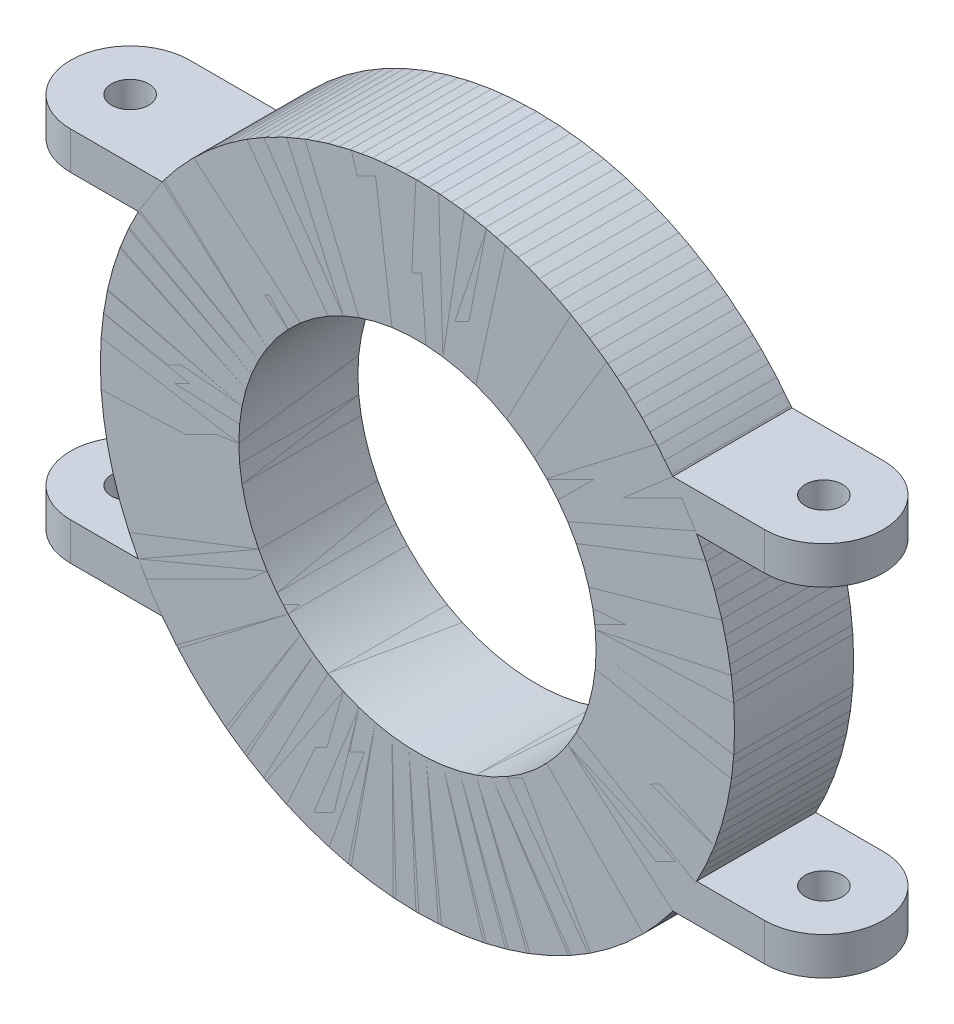
ISO-10303-21;
HEADER;
FILE_DESCRIPTION(('STEP AP214'),'2;1');
FILE_NAME('part.step','',(''),(''),'','','');
FILE_SCHEMA(('AUTOMOTIVE_DESIGN { 1 0 10303 214 1 1 1 1 }'));
ENDSEC;
DATA;
#1=APPLICATION_CONTEXT('core data for automotive mechanical design processes');
#2=APPLICATION_PROTOCOL_DEFINITION('international standard','automotive_design',2000,#1);
#3=PRODUCT_CONTEXT('',#1,'mechanical');
#4=PRODUCT('Part','Part','',(#3));
#5=PRODUCT_RELATED_PRODUCT_CATEGORY('part','',(#4));
#6=PRODUCT_DEFINITION_FORMATION('','',#4);
#7=PRODUCT_DEFINITION_CONTEXT('part definition',#1,'design');
#8=PRODUCT_DEFINITION('design','',#6,#7);
#9=PRODUCT_DEFINITION_SHAPE('','',#8);
#10=(LENGTH_UNIT() NAMED_UNIT(*) SI_UNIT(.MILLI.,.METRE.));
#11=(NAMED_UNIT(*) PLANE_ANGLE_UNIT() SI_UNIT($,.RADIAN.));
#12=(NAMED_UNIT(*) SI_UNIT($,.STERADIAN.) SOLID_ANGLE_UNIT());
#13=UNCERTAINTY_MEASURE_WITH_UNIT(LENGTH_MEASURE(1.E-05),#10,'distance_accuracy_value','');
#14=(GEOMETRIC_REPRESENTATION_CONTEXT(3) GLOBAL_UNCERTAINTY_ASSIGNED_CONTEXT((#13)) GLOBAL_UNIT_ASSIGNED_CONTEXT((#10,
#11,#12)) REPRESENTATION_CONTEXT('',''));
#15=CARTESIAN_POINT('',(0.,0.,0.));
#16=DIRECTION('',(0.,0.,1.));
#17=DIRECTION('',(1.,0.,0.));
#18=AXIS2_PLACEMENT_3D('',#15,#16,#17);
#19=CARTESIAN_POINT('',(0.,0.,8.));
#20=DIRECTION('',(0.,0.,-1.));
#21=DIRECTION('',(1.,0.,0.));
#22=AXIS2_PLACEMENT_3D('',#19,#20,#21);
#23=CYLINDRICAL_SURFACE('',#22,21.3);
#24=DIRECTION('',(0.,0.,-1.));
#25=VECTOR('',#24,1.);
#26=CARTESIAN_POINT('',(-17.1475286190912,12.6353576228553,8.));
#27=LINE('',#26,#25);
#28=CARTESIAN_POINT('',(-17.1475286190912,12.6353576228553,8.));
#29=VERTEX_POINT('',#28);
#30=CARTESIAN_POINT('',(-17.1475286190912,12.6353576228553,0.));
#31=VERTEX_POINT('',#30);
#32=EDGE_CURVE('E98',#29,#31,#27,.T.);
#33=ORIENTED_EDGE('',*,*,#32,.F.);
#34=CARTESIAN_POINT('',(0.,0.,8.));
#35=DIRECTION('',(0.,0.,1.));
#36=DIRECTION('',(-1.,0.,0.));
#37=AXIS2_PLACEMENT_3D('',#34,#35,#36);
#38=CIRCLE('',#37,21.3);
#39=CARTESIAN_POINT('',(-17.1475286190912,-12.6353576228553,8.));
#40=VERTEX_POINT('',#39);
#41=EDGE_CURVE('E82',#40,#29,#38,.T.);
#42=ORIENTED_EDGE('',*,*,#41,.F.);
#43=DIRECTION('',(0.,0.,-1.));
#44=VECTOR('',#43,1.);
#45=CARTESIAN_POINT('',(-17.1475286190912,-12.6353576228553,8.));
#46=LINE('',#45,#44);
#47=CARTESIAN_POINT('',(-17.1475286190912,-12.6353576228553,0.));
#48=VERTEX_POINT('',#47);
#49=EDGE_CURVE('E205',#40,#48,#46,.T.);
#50=ORIENTED_EDGE('',*,*,#49,.T.);
#51=CARTESIAN_POINT('',(0.,0.,0.));
#52=DIRECTION('',(0.,0.,1.));
#53=DIRECTION('',(-1.,0.,0.));
#54=AXIS2_PLACEMENT_3D('',#51,#52,#53);
#55=CIRCLE('',#54,21.3);
#56=EDGE_CURVE('E208',#48,#31,#55,.T.);
#57=ORIENTED_EDGE('',*,*,#56,.T.);
#58=EDGE_LOOP('',(#33,#42,#50,#57));
#59=FACE_BOUND('',#58,.T.);
#60=ADVANCED_FACE('F73',(#59),#23,.T.);
#61=CARTESIAN_POINT('',(-18.7510287943154,10.1039061335086,8.));
#62=VERTEX_POINT('',#61);
#63=CARTESIAN_POINT('',(-18.7510287943154,-10.1039061335086,8.));
#64=VERTEX_POINT('',#63);
#65=EDGE_CURVE('E90',#62,#64,#38,.T.);
#66=ORIENTED_EDGE('',*,*,#65,.F.);
#67=DIRECTION('',(0.,0.,-1.));
#68=VECTOR('',#67,1.);
#69=CARTESIAN_POINT('',(-18.7510287943154,10.1039061335086,8.));
#70=LINE('',#69,#68);
#71=CARTESIAN_POINT('',(-18.7510287943154,10.1039061335086,0.));
#72=VERTEX_POINT('',#71);
#73=EDGE_CURVE('E183',#62,#72,#70,.T.);
#74=ORIENTED_EDGE('',*,*,#73,.T.);
#75=CARTESIAN_POINT('',(-18.7510287943154,-10.1039061335086,0.));
#76=VERTEX_POINT('',#75);
#77=EDGE_CURVE('E207',#72,#76,#55,.T.);
#78=ORIENTED_EDGE('',*,*,#77,.T.);
#79=DIRECTION('',(0.,0.,-1.));
#80=VECTOR('',#79,1.);
#81=CARTESIAN_POINT('',(-18.7510287943154,-10.1039061335086,8.));
#82=LINE('',#81,#80);
#83=EDGE_CURVE('E202',#64,#76,#82,.T.);
#84=ORIENTED_EDGE('',*,*,#83,.F.);
#85=EDGE_LOOP('',(#66,#74,#78,#84));
#86=FACE_BOUND('',#85,.T.);
#87=ADVANCED_FACE('F75',(#86),#23,.T.);
#88=CARTESIAN_POINT('',(0.,0.,8.));
#89=DIRECTION('',(0.,0.,-1.));
#90=DIRECTION('',(1.,0.,0.));
#91=AXIS2_PLACEMENT_3D('',#88,#89,#90);
#92=CYLINDRICAL_SURFACE('',#91,12.);
#93=CARTESIAN_POINT('',(0.,0.,8.));
#94=DIRECTION('',(0.,0.,1.));
#95=DIRECTION('',(-1.,0.,0.));
#96=AXIS2_PLACEMENT_3D('',#93,#94,#95);
#97=CIRCLE('',#96,12.);
#98=CARTESIAN_POINT('',(-12.,0.,8.));
#99=VERTEX_POINT('',#98);
#100=EDGE_CURVE('E13',#99,#99,#97,.T.);
#101=ORIENTED_EDGE('',*,*,#100,.T.);
#102=EDGE_LOOP('',(#101));
#103=FACE_BOUND('',#102,.T.);
#104=CARTESIAN_POINT('',(0.,0.,0.));
#105=DIRECTION('',(0.,0.,1.));
#106=DIRECTION('',(-1.,0.,0.));
#107=AXIS2_PLACEMENT_3D('',#104,#105,#106);
#108=CIRCLE('',#107,12.);
#109=CARTESIAN_POINT('',(-12.,0.,0.));
#110=VERTEX_POINT('',#109);
#111=EDGE_CURVE('E77',#110,#110,#108,.T.);
#112=ORIENTED_EDGE('',*,*,#111,.F.);
#113=EDGE_LOOP('',(#112));
#114=FACE_BOUND('',#113,.T.);
#115=ADVANCED_FACE('F243',(#103,#114),#92,.F.);
#116=CARTESIAN_POINT('',(0.,0.,8.));
#117=DIRECTION('',(0.,0.,1.));
#118=DIRECTION('',(-1.,0.,0.));
#119=AXIS2_PLACEMENT_3D('',#116,#117,#118);
#120=PLANE('',#119);
#121=ORIENTED_EDGE('',*,*,#41,.T.);
#122=DIRECTION('',(1.,0.,0.));
#123=VECTOR('',#122,1.);
#124=CARTESIAN_POINT('',(-23.3,12.6353576228553,8.));
#125=LINE('',#124,#123);
#126=CARTESIAN_POINT('',(-23.3,12.6353576228553,8.));
#127=VERTEX_POINT('',#126);
#128=EDGE_CURVE('E179',#127,#29,#125,.T.);
#129=ORIENTED_EDGE('',*,*,#128,.F.);
#130=DIRECTION('',(0.,-1.,0.));
#131=VECTOR('',#130,1.);
#132=CARTESIAN_POINT('',(-23.3,0.,8.));
#133=LINE('',#132,#131);
#134=CARTESIAN_POINT('',(-23.3,10.1039061335086,8.));
#135=VERTEX_POINT('',#134);
#136=EDGE_CURVE('E150',#127,#135,#133,.T.);
#137=ORIENTED_EDGE('',*,*,#136,.T.);
#138=DIRECTION('',(1.,0.,0.));
#139=VECTOR('',#138,1.);
#140=CARTESIAN_POINT('',(-23.3,10.1039061335086,8.));
#141=LINE('',#140,#139);
#142=EDGE_CURVE('E174',#135,#62,#141,.T.);
#143=ORIENTED_EDGE('',*,*,#142,.T.);
#144=ORIENTED_EDGE('',*,*,#65,.T.);
#145=DIRECTION('',(1.,0.,0.));
#146=VECTOR('',#145,1.);
#147=CARTESIAN_POINT('',(-23.3,-10.1039061335086,8.));
#148=LINE('',#147,#146);
#149=CARTESIAN_POINT('',(-23.3,-10.1039061335086,8.));
#150=VERTEX_POINT('',#149);
#151=EDGE_CURVE('E193',#150,#64,#148,.T.);
#152=ORIENTED_EDGE('',*,*,#151,.F.);
#153=DIRECTION('',(0.,1.,0.));
#154=VECTOR('',#153,1.);
#155=CARTESIAN_POINT('',(-23.3,0.,8.));
#156=LINE('',#155,#154);
#157=CARTESIAN_POINT('',(-23.3,-12.6353576228553,8.));
#158=VERTEX_POINT('',#157);
#159=EDGE_CURVE('E188',#158,#150,#156,.T.);
#160=ORIENTED_EDGE('',*,*,#159,.F.);
#161=DIRECTION('',(1.,0.,0.));
#162=VECTOR('',#161,1.);
#163=CARTESIAN_POINT('',(-23.3,-12.6353576228553,8.));
#164=LINE('',#163,#162);
#165=EDGE_CURVE('E196',#158,#40,#164,.T.);
#166=ORIENTED_EDGE('',*,*,#165,.T.);
#167=EDGE_LOOP('',(#121,#129,#137,#143,#144,#152,#160,#166));
#168=FACE_BOUND('',#167,.T.);
#169=ORIENTED_EDGE('',*,*,#100,.F.);
#170=EDGE_LOOP('',(#169));
#171=FACE_BOUND('',#170,.T.);
#172=ADVANCED_FACE('F221',(#168,#171),#120,.T.);
#173=CARTESIAN_POINT('',(0.,0.,0.));
#174=DIRECTION('',(0.,0.,1.));
#175=DIRECTION('',(-1.,0.,0.));
#176=AXIS2_PLACEMENT_3D('',#173,#174,#175);
#177=PLANE('',#176);
#178=ORIENTED_EDGE('',*,*,#77,.F.);
#179=DIRECTION('',(1.,0.,0.));
#180=VECTOR('',#179,1.);
#181=CARTESIAN_POINT('',(-23.3,10.1039061335086,0.));
#182=LINE('',#181,#180);
#183=CARTESIAN_POINT('',(-23.3,10.1039061335086,0.));
#184=VERTEX_POINT('',#183);
#185=EDGE_CURVE('E149',#184,#72,#182,.T.);
#186=ORIENTED_EDGE('',*,*,#185,.F.);
#187=DIRECTION('',(0.,-1.,0.));
#188=VECTOR('',#187,1.);
#189=CARTESIAN_POINT('',(-23.3,12.6353576228553,0.));
#190=LINE('',#189,#188);
#191=CARTESIAN_POINT('',(-23.3,12.6353576228553,0.));
#192=VERTEX_POINT('',#191);
#193=EDGE_CURVE('E153',#192,#184,#190,.T.);
#194=ORIENTED_EDGE('',*,*,#193,.F.);
#195=DIRECTION('',(1.,0.,0.));
#196=VECTOR('',#195,1.);
#197=CARTESIAN_POINT('',(-23.3,12.6353576228553,0.));
#198=LINE('',#197,#196);
#199=EDGE_CURVE('E141',#192,#31,#198,.T.);
#200=ORIENTED_EDGE('',*,*,#199,.T.);
#201=ORIENTED_EDGE('',*,*,#56,.F.);
#202=DIRECTION('',(1.,0.,0.));
#203=VECTOR('',#202,1.);
#204=CARTESIAN_POINT('',(-23.3,-12.6353576228553,0.));
#205=LINE('',#204,#203);
#206=CARTESIAN_POINT('',(-23.3,-12.6353576228553,0.));
#207=VERTEX_POINT('',#206);
#208=EDGE_CURVE('E199',#207,#48,#205,.T.);
#209=ORIENTED_EDGE('',*,*,#208,.F.);
#210=DIRECTION('',(0.,1.,0.));
#211=VECTOR('',#210,1.);
#212=CARTESIAN_POINT('',(-23.3,0.,0.));
#213=LINE('',#212,#211);
#214=CARTESIAN_POINT('',(-23.3,-10.1039061335086,0.));
#215=VERTEX_POINT('',#214);
#216=EDGE_CURVE('E185',#207,#215,#213,.T.);
#217=ORIENTED_EDGE('',*,*,#216,.T.);
#218=DIRECTION('',(1.,0.,0.));
#219=VECTOR('',#218,1.);
#220=CARTESIAN_POINT('',(-23.3,-10.1039061335086,0.));
#221=LINE('',#220,#219);
#222=EDGE_CURVE('E190',#215,#76,#221,.T.);
#223=ORIENTED_EDGE('',*,*,#222,.T.);
#224=EDGE_LOOP('',(#178,#186,#194,#200,#201,#209,#217,#223));
#225=FACE_BOUND('',#224,.T.);
#226=ORIENTED_EDGE('',*,*,#111,.T.);
#227=EDGE_LOOP('',(#226));
#228=FACE_BOUND('',#227,.T.);
#229=ADVANCED_FACE('F154',(#225,#228),#177,.F.);
#230=CARTESIAN_POINT('',(-23.3,-12.6353576228553,0.));
#231=DIRECTION('',(0.,-1.,0.));
#232=DIRECTION('',(0.,0.,1.));
#233=AXIS2_PLACEMENT_3D('',#230,#231,#232);
#234=PLANE('',#233);
#235=CARTESIAN_POINT('',(-23.3,-12.6353576228553,4.));
#236=DIRECTION('',(0.,-1.,0.));
#237=DIRECTION('',(0.,0.,1.));
#238=AXIS2_PLACEMENT_3D('',#235,#236,#237);
#239=CIRCLE('',#238,1.25);
#240=CARTESIAN_POINT('',(-23.3,-12.6353576228553,5.25));
#241=VERTEX_POINT('',#240);
#242=EDGE_CURVE('E263',#241,#241,#239,.F.);
#243=ORIENTED_EDGE('',*,*,#242,.T.);
#244=EDGE_LOOP('',(#243));
#245=FACE_BOUND('',#244,.T.);
#246=ORIENTED_EDGE('',*,*,#165,.F.);
#247=CARTESIAN_POINT('',(-23.3,-12.6353576228553,4.));
#248=DIRECTION('',(0.,1.,0.));
#249=DIRECTION('',(0.,0.,-1.));
#250=AXIS2_PLACEMENT_3D('',#247,#248,#249);
#251=CIRCLE('',#250,4.);
#252=EDGE_CURVE('E164',#207,#158,#251,.T.);
#253=ORIENTED_EDGE('',*,*,#252,.F.);
#254=ORIENTED_EDGE('',*,*,#208,.T.);
#255=ORIENTED_EDGE('',*,*,#49,.F.);
#256=EDGE_LOOP('',(#246,#253,#254,#255));
#257=FACE_BOUND('',#256,.T.);
#258=ADVANCED_FACE('F234',(#245,#257),#234,.T.);
#259=CARTESIAN_POINT('',(-23.3,-10.1039061335086,0.));
#260=DIRECTION('',(0.,-1.,0.));
#261=DIRECTION('',(0.,0.,1.));
#262=AXIS2_PLACEMENT_3D('',#259,#260,#261);
#263=PLANE('',#262);
#264=CARTESIAN_POINT('',(-23.3,-10.1039061335086,4.));
#265=DIRECTION('',(0.,-1.,0.));
#266=DIRECTION('',(0.,0.,1.));
#267=AXIS2_PLACEMENT_3D('',#264,#265,#266);
#268=CIRCLE('',#267,1.25);
#269=CARTESIAN_POINT('',(-23.3,-10.1039061335086,5.25));
#270=VERTEX_POINT('',#269);
#271=EDGE_CURVE('E169',#270,#270,#268,.T.);
#272=ORIENTED_EDGE('',*,*,#271,.T.);
#273=EDGE_LOOP('',(#272));
#274=FACE_BOUND('',#273,.T.);
#275=ORIENTED_EDGE('',*,*,#222,.F.);
#276=CARTESIAN_POINT('',(-23.3,-10.1039061335086,4.));
#277=DIRECTION('',(0.,1.,0.));
#278=DIRECTION('',(0.,0.,-1.));
#279=AXIS2_PLACEMENT_3D('',#276,#277,#278);
#280=CIRCLE('',#279,4.);
#281=EDGE_CURVE('E167',#215,#150,#280,.T.);
#282=ORIENTED_EDGE('',*,*,#281,.T.);
#283=ORIENTED_EDGE('',*,*,#151,.T.);
#284=ORIENTED_EDGE('',*,*,#83,.T.);
#285=EDGE_LOOP('',(#275,#282,#283,#284));
#286=FACE_BOUND('',#285,.T.);
#287=ADVANCED_FACE('F212',(#274,#286),#263,.F.);
#288=CARTESIAN_POINT('',(-23.3,10.1039061335086,0.));
#289=DIRECTION('',(0.,-1.,0.));
#290=DIRECTION('',(0.,0.,1.));
#291=AXIS2_PLACEMENT_3D('',#288,#289,#290);
#292=PLANE('',#291);
#293=CARTESIAN_POINT('',(-23.3,10.1039061335086,4.));
#294=DIRECTION('',(0.,-1.,0.));
#295=DIRECTION('',(0.,0.,1.));
#296=AXIS2_PLACEMENT_3D('',#293,#294,#295);
#297=CIRCLE('',#296,1.25);
#298=CARTESIAN_POINT('',(-23.3,10.1039061335086,5.25));
#299=VERTEX_POINT('',#298);
#300=EDGE_CURVE('E266',#299,#299,#297,.T.);
#301=ORIENTED_EDGE('',*,*,#300,.F.);
#302=EDGE_LOOP('',(#301));
#303=FACE_BOUND('',#302,.T.);
#304=ORIENTED_EDGE('',*,*,#142,.F.);
#305=CARTESIAN_POINT('',(-23.3,10.1039061335086,4.));
#306=DIRECTION('',(0.,1.,0.));
#307=DIRECTION('',(0.,0.,-1.));
#308=AXIS2_PLACEMENT_3D('',#305,#306,#307);
#309=CIRCLE('',#308,4.);
#310=EDGE_CURVE('E165',#184,#135,#309,.T.);
#311=ORIENTED_EDGE('',*,*,#310,.F.);
#312=ORIENTED_EDGE('',*,*,#185,.T.);
#313=ORIENTED_EDGE('',*,*,#73,.F.);
#314=EDGE_LOOP('',(#304,#311,#312,#313));
#315=FACE_BOUND('',#314,.T.);
#316=ADVANCED_FACE('F224',(#303,#315),#292,.T.);
#317=CARTESIAN_POINT('',(-23.3,12.6353576228553,0.));
#318=DIRECTION('',(0.,-1.,0.));
#319=DIRECTION('',(0.,0.,1.));
#320=AXIS2_PLACEMENT_3D('',#317,#318,#319);
#321=PLANE('',#320);
#322=CARTESIAN_POINT('',(-23.3,12.6353576228553,4.));
#323=DIRECTION('',(0.,1.,0.));
#324=DIRECTION('',(0.,0.,-1.));
#325=AXIS2_PLACEMENT_3D('',#322,#323,#324);
#326=CIRCLE('',#325,1.25);
#327=CARTESIAN_POINT('',(-23.3,12.6353576228553,2.75));
#328=VERTEX_POINT('',#327);
#329=EDGE_CURVE('E267',#328,#328,#326,.T.);
#330=ORIENTED_EDGE('',*,*,#329,.F.);
#331=EDGE_LOOP('',(#330));
#332=FACE_BOUND('',#331,.T.);
#333=ORIENTED_EDGE('',*,*,#199,.F.);
#334=CARTESIAN_POINT('',(-23.3,12.6353576228553,4.));
#335=DIRECTION('',(0.,1.,0.));
#336=DIRECTION('',(0.,0.,-1.));
#337=AXIS2_PLACEMENT_3D('',#334,#335,#336);
#338=CIRCLE('',#337,4.);
#339=EDGE_CURVE('E146',#192,#127,#338,.T.);
#340=ORIENTED_EDGE('',*,*,#339,.T.);
#341=ORIENTED_EDGE('',*,*,#128,.T.);
#342=ORIENTED_EDGE('',*,*,#32,.T.);
#343=EDGE_LOOP('',(#333,#340,#341,#342));
#344=FACE_BOUND('',#343,.T.);
#345=ADVANCED_FACE('F143',(#332,#344),#321,.F.);
#346=CARTESIAN_POINT('',(-23.3,-10.1039061335086,4.));
#347=DIRECTION('',(0.,1.,0.));
#348=DIRECTION('',(0.,0.,-1.));
#349=AXIS2_PLACEMENT_3D('',#346,#347,#348);
#350=CYLINDRICAL_SURFACE('',#349,4.);
#351=ORIENTED_EDGE('',*,*,#252,.T.);
#352=ORIENTED_EDGE('',*,*,#159,.T.);
#353=ORIENTED_EDGE('',*,*,#281,.F.);
#354=ORIENTED_EDGE('',*,*,#216,.F.);
#355=EDGE_LOOP('',(#351,#352,#353,#354));
#356=FACE_BOUND('',#355,.T.);
#357=ADVANCED_FACE('F217',(#356),#350,.T.);
#358=CARTESIAN_POINT('',(-23.3,12.6353576228553,4.));
#359=DIRECTION('',(0.,1.,0.));
#360=DIRECTION('',(0.,0.,-1.));
#361=AXIS2_PLACEMENT_3D('',#358,#359,#360);
#362=CYLINDRICAL_SURFACE('',#361,4.);
#363=ORIENTED_EDGE('',*,*,#310,.T.);
#364=ORIENTED_EDGE('',*,*,#136,.F.);
#365=ORIENTED_EDGE('',*,*,#339,.F.);
#366=ORIENTED_EDGE('',*,*,#193,.T.);
#367=EDGE_LOOP('',(#363,#364,#365,#366));
#368=FACE_BOUND('',#367,.T.);
#369=ADVANCED_FACE('F162',(#368),#362,.T.);
#370=CARTESIAN_POINT('',(-23.3,-16.170891528788,4.));
#371=DIRECTION('',(0.,1.,0.));
#372=DIRECTION('',(0.,0.,-1.));
#373=AXIS2_PLACEMENT_3D('',#370,#371,#372);
#374=CYLINDRICAL_SURFACE('',#373,1.25);
#375=ORIENTED_EDGE('',*,*,#300,.T.);
#376=EDGE_LOOP('',(#375));
#377=FACE_BOUND('',#376,.T.);
#378=ORIENTED_EDGE('',*,*,#329,.T.);
#379=EDGE_LOOP('',(#378));
#380=FACE_BOUND('',#379,.T.);
#381=ADVANCED_FACE('F278',(#377,#380),#374,.F.);
#382=ORIENTED_EDGE('',*,*,#242,.F.);
#383=EDGE_LOOP('',(#382));
#384=FACE_BOUND('',#383,.T.);
#385=ORIENTED_EDGE('',*,*,#271,.F.);
#386=EDGE_LOOP('',(#385));
#387=FACE_BOUND('',#386,.T.);
#388=ADVANCED_FACE('F276',(#384,#387),#374,.F.);
#389=CLOSED_SHELL('',(#60,#87,#115,#172,#229,#258,#287,#316,#345,#357,#369,#381,#388));
#390=MANIFOLD_SOLID_BREP('B2',#389);
#391=CARTESIAN_POINT('',(0.,0.,8.));
#392=DIRECTION('',(0.,0.,-1.));
#393=DIRECTION('',(-1.,0.,0.));
#394=AXIS2_PLACEMENT_3D('',#391,#392,#393);
#395=CYLINDRICAL_SURFACE('',#394,21.3);
#396=DIRECTION('',(0.,0.,-1.));
#397=VECTOR('',#396,1.);
#398=CARTESIAN_POINT('',(17.1475286190912,-12.6353576228553,8.));
#399=LINE('',#398,#397);
#400=CARTESIAN_POINT('',(17.1475286190912,-12.6353576228553,8.));
#401=VERTEX_POINT('',#400);
#402=CARTESIAN_POINT('',(17.1475286190912,-12.6353576228553,0.));
#403=VERTEX_POINT('',#402);
#404=EDGE_CURVE('E427',#401,#403,#399,.T.);
#405=ORIENTED_EDGE('',*,*,#404,.F.);
#406=CARTESIAN_POINT('',(0.,0.,8.));
#407=DIRECTION('',(0.,0.,1.));
#408=DIRECTION('',(1.,0.,0.));
#409=AXIS2_PLACEMENT_3D('',#406,#407,#408);
#410=CIRCLE('',#409,21.3);
#411=CARTESIAN_POINT('',(17.1475286190912,12.6353576228553,8.));
#412=VERTEX_POINT('',#411);
#413=EDGE_CURVE('E411',#412,#401,#410,.T.);
#414=ORIENTED_EDGE('',*,*,#413,.F.);
#415=DIRECTION('',(0.,0.,-1.));
#416=VECTOR('',#415,1.);
#417=CARTESIAN_POINT('',(17.1475286190912,12.6353576228553,8.));
#418=LINE('',#417,#416);
#419=CARTESIAN_POINT('',(17.1475286190912,12.6353576228553,0.));
#420=VERTEX_POINT('',#419);
#421=EDGE_CURVE('E534',#412,#420,#418,.T.);
#422=ORIENTED_EDGE('',*,*,#421,.T.);
#423=CARTESIAN_POINT('',(0.,0.,0.));
#424=DIRECTION('',(0.,0.,1.));
#425=DIRECTION('',(1.,0.,0.));
#426=AXIS2_PLACEMENT_3D('',#423,#424,#425);
#427=CIRCLE('',#426,21.3);
#428=EDGE_CURVE('E537',#420,#403,#427,.T.);
#429=ORIENTED_EDGE('',*,*,#428,.T.);
#430=EDGE_LOOP('',(#405,#414,#422,#429));
#431=FACE_BOUND('',#430,.T.);
#432=ADVANCED_FACE('F402',(#431),#395,.T.);
#433=CARTESIAN_POINT('',(18.7510287943154,-10.1039061335086,8.));
#434=VERTEX_POINT('',#433);
#435=CARTESIAN_POINT('',(18.7510287943154,10.1039061335086,8.));
#436=VERTEX_POINT('',#435);
#437=EDGE_CURVE('E419',#434,#436,#410,.T.);
#438=ORIENTED_EDGE('',*,*,#437,.F.);
#439=DIRECTION('',(0.,0.,-1.));
#440=VECTOR('',#439,1.);
#441=CARTESIAN_POINT('',(18.7510287943154,-10.1039061335086,8.));
#442=LINE('',#441,#440);
#443=CARTESIAN_POINT('',(18.7510287943154,-10.1039061335086,0.));
#444=VERTEX_POINT('',#443);
#445=EDGE_CURVE('E512',#434,#444,#442,.T.);
#446=ORIENTED_EDGE('',*,*,#445,.T.);
#447=CARTESIAN_POINT('',(18.7510287943154,10.1039061335086,0.));
#448=VERTEX_POINT('',#447);
#449=EDGE_CURVE('E536',#444,#448,#427,.T.);
#450=ORIENTED_EDGE('',*,*,#449,.T.);
#451=DIRECTION('',(0.,0.,-1.));
#452=VECTOR('',#451,1.);
#453=CARTESIAN_POINT('',(18.7510287943154,10.1039061335086,8.));
#454=LINE('',#453,#452);
#455=EDGE_CURVE('E531',#436,#448,#454,.T.);
#456=ORIENTED_EDGE('',*,*,#455,.F.);
#457=EDGE_LOOP('',(#438,#446,#450,#456));
#458=FACE_BOUND('',#457,.T.);
#459=ADVANCED_FACE('F404',(#458),#395,.T.);
#460=CARTESIAN_POINT('',(0.,0.,8.));
#461=DIRECTION('',(0.,0.,-1.));
#462=DIRECTION('',(-1.,0.,0.));
#463=AXIS2_PLACEMENT_3D('',#460,#461,#462);
#464=CYLINDRICAL_SURFACE('',#463,12.);
#465=CARTESIAN_POINT('',(0.,0.,8.));
#466=DIRECTION('',(0.,0.,1.));
#467=DIRECTION('',(1.,0.,0.));
#468=AXIS2_PLACEMENT_3D('',#465,#466,#467);
#469=CIRCLE('',#468,12.);
#470=CARTESIAN_POINT('',(12.,0.,8.));
#471=VERTEX_POINT('',#470);
#472=EDGE_CURVE('E71',#471,#471,#469,.T.);
#473=ORIENTED_EDGE('',*,*,#472,.T.);
#474=EDGE_LOOP('',(#473));
#475=FACE_BOUND('',#474,.T.);
#476=CARTESIAN_POINT('',(0.,0.,0.));
#477=DIRECTION('',(0.,0.,1.));
#478=DIRECTION('',(1.,0.,0.));
#479=AXIS2_PLACEMENT_3D('',#476,#477,#478);
#480=CIRCLE('',#479,12.);
#481=CARTESIAN_POINT('',(12.,0.,0.));
#482=VERTEX_POINT('',#481);
#483=EDGE_CURVE('E406',#482,#482,#480,.T.);
#484=ORIENTED_EDGE('',*,*,#483,.F.);
#485=EDGE_LOOP('',(#484));
#486=FACE_BOUND('',#485,.T.);
#487=ADVANCED_FACE('F572',(#475,#486),#464,.F.);
#488=CARTESIAN_POINT('',(0.,0.,8.));
#489=DIRECTION('',(0.,0.,1.));
#490=DIRECTION('',(1.,0.,0.));
#491=AXIS2_PLACEMENT_3D('',#488,#489,#490);
#492=PLANE('',#491);
#493=ORIENTED_EDGE('',*,*,#413,.T.);
#494=DIRECTION('',(-1.,0.,0.));
#495=VECTOR('',#494,1.);
#496=CARTESIAN_POINT('',(23.3,-12.6353576228553,8.));
#497=LINE('',#496,#495);
#498=CARTESIAN_POINT('',(23.3,-12.6353576228553,8.));
#499=VERTEX_POINT('',#498);
#500=EDGE_CURVE('E508',#499,#401,#497,.T.);
#501=ORIENTED_EDGE('',*,*,#500,.F.);
#502=DIRECTION('',(0.,1.,0.));
#503=VECTOR('',#502,1.);
#504=CARTESIAN_POINT('',(23.3,0.,8.));
#505=LINE('',#504,#503);
#506=CARTESIAN_POINT('',(23.3,-10.1039061335086,8.));
#507=VERTEX_POINT('',#506);
#508=EDGE_CURVE('E479',#499,#507,#505,.T.);
#509=ORIENTED_EDGE('',*,*,#508,.T.);
#510=DIRECTION('',(-1.,0.,0.));
#511=VECTOR('',#510,1.);
#512=CARTESIAN_POINT('',(23.3,-10.1039061335086,8.));
#513=LINE('',#512,#511);
#514=EDGE_CURVE('E503',#507,#434,#513,.T.);
#515=ORIENTED_EDGE('',*,*,#514,.T.);
#516=ORIENTED_EDGE('',*,*,#437,.T.);
#517=DIRECTION('',(-1.,0.,0.));
#518=VECTOR('',#517,1.);
#519=CARTESIAN_POINT('',(23.3,10.1039061335086,8.));
#520=LINE('',#519,#518);
#521=CARTESIAN_POINT('',(23.3,10.1039061335086,8.));
#522=VERTEX_POINT('',#521);
#523=EDGE_CURVE('E522',#522,#436,#520,.T.);
#524=ORIENTED_EDGE('',*,*,#523,.F.);
#525=DIRECTION('',(0.,-1.,0.));
#526=VECTOR('',#525,1.);
#527=CARTESIAN_POINT('',(23.3,0.,8.));
#528=LINE('',#527,#526);
#529=CARTESIAN_POINT('',(23.3,12.6353576228553,8.));
#530=VERTEX_POINT('',#529);
#531=EDGE_CURVE('E517',#530,#522,#528,.T.);
#532=ORIENTED_EDGE('',*,*,#531,.F.);
#533=DIRECTION('',(-1.,0.,0.));
#534=VECTOR('',#533,1.);
#535=CARTESIAN_POINT('',(23.3,12.6353576228553,8.));
#536=LINE('',#535,#534);
#537=EDGE_CURVE('E525',#530,#412,#536,.T.);
#538=ORIENTED_EDGE('',*,*,#537,.T.);
#539=EDGE_LOOP('',(#493,#501,#509,#515,#516,#524,#532,#538));
#540=FACE_BOUND('',#539,.T.);
#541=ORIENTED_EDGE('',*,*,#472,.F.);
#542=EDGE_LOOP('',(#541));
#543=FACE_BOUND('',#542,.T.);
#544=ADVANCED_FACE('F550',(#540,#543),#492,.T.);
#545=CARTESIAN_POINT('',(0.,0.,0.));
#546=DIRECTION('',(0.,0.,1.));
#547=DIRECTION('',(1.,0.,0.));
#548=AXIS2_PLACEMENT_3D('',#545,#546,#547);
#549=PLANE('',#548);
#550=ORIENTED_EDGE('',*,*,#449,.F.);
#551=DIRECTION('',(-1.,0.,0.));
#552=VECTOR('',#551,1.);
#553=CARTESIAN_POINT('',(23.3,-10.1039061335086,0.));
#554=LINE('',#553,#552);
#555=CARTESIAN_POINT('',(23.3,-10.1039061335086,0.));
#556=VERTEX_POINT('',#555);
#557=EDGE_CURVE('E478',#556,#444,#554,.T.);
#558=ORIENTED_EDGE('',*,*,#557,.F.);
#559=DIRECTION('',(0.,1.,0.));
#560=VECTOR('',#559,1.);
#561=CARTESIAN_POINT('',(23.3,-12.6353576228553,0.));
#562=LINE('',#561,#560);
#563=CARTESIAN_POINT('',(23.3,-12.6353576228553,0.));
#564=VERTEX_POINT('',#563);
#565=EDGE_CURVE('E482',#564,#556,#562,.T.);
#566=ORIENTED_EDGE('',*,*,#565,.F.);
#567=DIRECTION('',(-1.,0.,0.));
#568=VECTOR('',#567,1.);
#569=CARTESIAN_POINT('',(23.3,-12.6353576228553,0.));
#570=LINE('',#569,#568);
#571=EDGE_CURVE('E470',#564,#403,#570,.T.);
#572=ORIENTED_EDGE('',*,*,#571,.T.);
#573=ORIENTED_EDGE('',*,*,#428,.F.);
#574=DIRECTION('',(-1.,0.,0.));
#575=VECTOR('',#574,1.);
#576=CARTESIAN_POINT('',(23.3,12.6353576228553,0.));
#577=LINE('',#576,#575);
#578=CARTESIAN_POINT('',(23.3,12.6353576228553,0.));
#579=VERTEX_POINT('',#578);
#580=EDGE_CURVE('E528',#579,#420,#577,.T.);
#581=ORIENTED_EDGE('',*,*,#580,.F.);
#582=DIRECTION('',(0.,-1.,0.));
#583=VECTOR('',#582,1.);
#584=CARTESIAN_POINT('',(23.3,0.,0.));
#585=LINE('',#584,#583);
#586=CARTESIAN_POINT('',(23.3,10.1039061335086,0.));
#587=VERTEX_POINT('',#586);
#588=EDGE_CURVE('E514',#579,#587,#585,.T.);
#589=ORIENTED_EDGE('',*,*,#588,.T.);
#590=DIRECTION('',(-1.,0.,0.));
#591=VECTOR('',#590,1.);
#592=CARTESIAN_POINT('',(23.3,10.1039061335086,0.));
#593=LINE('',#592,#591);
#594=EDGE_CURVE('E519',#587,#448,#593,.T.);
#595=ORIENTED_EDGE('',*,*,#594,.T.);
#596=EDGE_LOOP('',(#550,#558,#566,#572,#573,#581,#589,#595));
#597=FACE_BOUND('',#596,.T.);
#598=ORIENTED_EDGE('',*,*,#483,.T.);
#599=EDGE_LOOP('',(#598));
#600=FACE_BOUND('',#599,.T.);
#601=ADVANCED_FACE('F483',(#597,#600),#549,.F.);
#602=CARTESIAN_POINT('',(23.3,12.6353576228553,0.));
#603=DIRECTION('',(0.,1.,0.));
#604=DIRECTION('',(0.,0.,1.));
#605=AXIS2_PLACEMENT_3D('',#602,#603,#604);
#606=PLANE('',#605);
#607=CARTESIAN_POINT('',(23.3,12.6353576228553,4.));
#608=DIRECTION('',(0.,1.,0.));
#609=DIRECTION('',(0.,0.,1.));
#610=AXIS2_PLACEMENT_3D('',#607,#608,#609);
#611=CIRCLE('',#610,1.25);
#612=CARTESIAN_POINT('',(23.3,12.6353576228553,5.25));
#613=VERTEX_POINT('',#612);
#614=EDGE_CURVE('E592',#613,#613,#611,.F.);
#615=ORIENTED_EDGE('',*,*,#614,.T.);
#616=EDGE_LOOP('',(#615));
#617=FACE_BOUND('',#616,.T.);
#618=ORIENTED_EDGE('',*,*,#537,.F.);
#619=CARTESIAN_POINT('',(23.3,12.6353576228553,4.));
#620=DIRECTION('',(0.,-1.,0.));
#621=DIRECTION('',(0.,0.,-1.));
#622=AXIS2_PLACEMENT_3D('',#619,#620,#621);
#623=CIRCLE('',#622,4.);
#624=EDGE_CURVE('E493',#579,#530,#623,.T.);
#625=ORIENTED_EDGE('',*,*,#624,.F.);
#626=ORIENTED_EDGE('',*,*,#580,.T.);
#627=ORIENTED_EDGE('',*,*,#421,.F.);
#628=EDGE_LOOP('',(#618,#625,#626,#627));
#629=FACE_BOUND('',#628,.T.);
#630=ADVANCED_FACE('F563',(#617,#629),#606,.T.);
#631=CARTESIAN_POINT('',(23.3,10.1039061335086,0.));
#632=DIRECTION('',(0.,1.,0.));
#633=DIRECTION('',(0.,0.,1.));
#634=AXIS2_PLACEMENT_3D('',#631,#632,#633);
#635=PLANE('',#634);
#636=CARTESIAN_POINT('',(23.3,10.1039061335086,4.));
#637=DIRECTION('',(0.,1.,0.));
#638=DIRECTION('',(0.,0.,1.));
#639=AXIS2_PLACEMENT_3D('',#636,#637,#638);
#640=CIRCLE('',#639,1.25);
#641=CARTESIAN_POINT('',(23.3,10.1039061335086,5.25));
#642=VERTEX_POINT('',#641);
#643=EDGE_CURVE('E498',#642,#642,#640,.T.);
#644=ORIENTED_EDGE('',*,*,#643,.T.);
#645=EDGE_LOOP('',(#644));
#646=FACE_BOUND('',#645,.T.);
#647=ORIENTED_EDGE('',*,*,#594,.F.);
#648=CARTESIAN_POINT('',(23.3,10.1039061335086,4.));
#649=DIRECTION('',(0.,-1.,0.));
#650=DIRECTION('',(0.,0.,-1.));
#651=AXIS2_PLACEMENT_3D('',#648,#649,#650);
#652=CIRCLE('',#651,4.);
#653=EDGE_CURVE('E496',#587,#522,#652,.T.);
#654=ORIENTED_EDGE('',*,*,#653,.T.);
#655=ORIENTED_EDGE('',*,*,#523,.T.);
#656=ORIENTED_EDGE('',*,*,#455,.T.);
#657=EDGE_LOOP('',(#647,#654,#655,#656));
#658=FACE_BOUND('',#657,.T.);
#659=ADVANCED_FACE('F541',(#646,#658),#635,.F.);
#660=CARTESIAN_POINT('',(23.3,-10.1039061335086,0.));
#661=DIRECTION('',(0.,1.,0.));
#662=DIRECTION('',(0.,0.,1.));
#663=AXIS2_PLACEMENT_3D('',#660,#661,#662);
#664=PLANE('',#663);
#665=CARTESIAN_POINT('',(23.3,-10.1039061335086,4.));
#666=DIRECTION('',(0.,1.,0.));
#667=DIRECTION('',(0.,0.,1.));
#668=AXIS2_PLACEMENT_3D('',#665,#666,#667);
#669=CIRCLE('',#668,1.25);
#670=CARTESIAN_POINT('',(23.3,-10.1039061335086,5.25));
#671=VERTEX_POINT('',#670);
#672=EDGE_CURVE('E595',#671,#671,#669,.T.);
#673=ORIENTED_EDGE('',*,*,#672,.F.);
#674=EDGE_LOOP('',(#673));
#675=FACE_BOUND('',#674,.T.);
#676=ORIENTED_EDGE('',*,*,#514,.F.);
#677=CARTESIAN_POINT('',(23.3,-10.1039061335086,4.));
#678=DIRECTION('',(0.,-1.,0.));
#679=DIRECTION('',(0.,0.,-1.));
#680=AXIS2_PLACEMENT_3D('',#677,#678,#679);
#681=CIRCLE('',#680,4.);
#682=EDGE_CURVE('E494',#556,#507,#681,.T.);
#683=ORIENTED_EDGE('',*,*,#682,.F.);
#684=ORIENTED_EDGE('',*,*,#557,.T.);
#685=ORIENTED_EDGE('',*,*,#445,.F.);
#686=EDGE_LOOP('',(#676,#683,#684,#685));
#687=FACE_BOUND('',#686,.T.);
#688=ADVANCED_FACE('F553',(#675,#687),#664,.T.);
#689=CARTESIAN_POINT('',(23.3,-12.6353576228553,0.));
#690=DIRECTION('',(0.,1.,0.));
#691=DIRECTION('',(0.,0.,1.));
#692=AXIS2_PLACEMENT_3D('',#689,#690,#691);
#693=PLANE('',#692);
#694=CARTESIAN_POINT('',(23.3,-12.6353576228553,4.));
#695=DIRECTION('',(0.,-1.,0.));
#696=DIRECTION('',(0.,0.,-1.));
#697=AXIS2_PLACEMENT_3D('',#694,#695,#696);
#698=CIRCLE('',#697,1.25);
#699=CARTESIAN_POINT('',(23.3,-12.6353576228553,2.75));
#700=VERTEX_POINT('',#699);
#701=EDGE_CURVE('E596',#700,#700,#698,.T.);
#702=ORIENTED_EDGE('',*,*,#701,.F.);
#703=EDGE_LOOP('',(#702));
#704=FACE_BOUND('',#703,.T.);
#705=ORIENTED_EDGE('',*,*,#571,.F.);
#706=CARTESIAN_POINT('',(23.3,-12.6353576228553,4.));
#707=DIRECTION('',(0.,-1.,0.));
#708=DIRECTION('',(0.,0.,-1.));
#709=AXIS2_PLACEMENT_3D('',#706,#707,#708);
#710=CIRCLE('',#709,4.);
#711=EDGE_CURVE('E475',#564,#499,#710,.T.);
#712=ORIENTED_EDGE('',*,*,#711,.T.);
#713=ORIENTED_EDGE('',*,*,#500,.T.);
#714=ORIENTED_EDGE('',*,*,#404,.T.);
#715=EDGE_LOOP('',(#705,#712,#713,#714));
#716=FACE_BOUND('',#715,.T.);
#717=ADVANCED_FACE('F472',(#704,#716),#693,.F.);
#718=CARTESIAN_POINT('',(23.3,10.1039061335086,4.));
#719=DIRECTION('',(0.,-1.,0.));
#720=DIRECTION('',(0.,0.,-1.));
#721=AXIS2_PLACEMENT_3D('',#718,#719,#720);
#722=CYLINDRICAL_SURFACE('',#721,4.);
#723=ORIENTED_EDGE('',*,*,#624,.T.);
#724=ORIENTED_EDGE('',*,*,#531,.T.);
#725=ORIENTED_EDGE('',*,*,#653,.F.);
#726=ORIENTED_EDGE('',*,*,#588,.F.);
#727=EDGE_LOOP('',(#723,#724,#725,#726));
#728=FACE_BOUND('',#727,.T.);
#729=ADVANCED_FACE('F546',(#728),#722,.T.);
#730=CARTESIAN_POINT('',(23.3,-12.6353576228553,4.));
#731=DIRECTION('',(0.,-1.,0.));
#732=DIRECTION('',(0.,0.,-1.));
#733=AXIS2_PLACEMENT_3D('',#730,#731,#732);
#734=CYLINDRICAL_SURFACE('',#733,4.);
#735=ORIENTED_EDGE('',*,*,#682,.T.);
#736=ORIENTED_EDGE('',*,*,#508,.F.);
#737=ORIENTED_EDGE('',*,*,#711,.F.);
#738=ORIENTED_EDGE('',*,*,#565,.T.);
#739=EDGE_LOOP('',(#735,#736,#737,#738));
#740=FACE_BOUND('',#739,.T.);
#741=ADVANCED_FACE('F491',(#740),#734,.T.);
#742=CARTESIAN_POINT('',(23.3,16.170891528788,4.));
#743=DIRECTION('',(0.,-1.,0.));
#744=DIRECTION('',(0.,0.,-1.));
#745=AXIS2_PLACEMENT_3D('',#742,#743,#744);
#746=CYLINDRICAL_SURFACE('',#745,1.25);
#747=ORIENTED_EDGE('',*,*,#672,.T.);
#748=EDGE_LOOP('',(#747));
#749=FACE_BOUND('',#748,.T.);
#750=ORIENTED_EDGE('',*,*,#701,.T.);
#751=EDGE_LOOP('',(#750));
#752=FACE_BOUND('',#751,.T.);
#753=ADVANCED_FACE('F607',(#749,#752),#746,.F.);
#754=ORIENTED_EDGE('',*,*,#614,.F.);
#755=EDGE_LOOP('',(#754));
#756=FACE_BOUND('',#755,.T.);
#757=ORIENTED_EDGE('',*,*,#643,.F.);
#758=EDGE_LOOP('',(#757));
#759=FACE_BOUND('',#758,.T.);
#760=ADVANCED_FACE('F605',(#756,#759),#746,.F.);
#761=CLOSED_SHELL('',(#432,#459,#487,#544,#601,#630,#659,#688,#717,#729,#741,#753,#760));
#762=MANIFOLD_SOLID_BREP('B7',#761);
#763=ADVANCED_BREP_SHAPE_REPRESENTATION('',(#18,#390,#762),#14);
#764=SHAPE_DEFINITION_REPRESENTATION(#9,#763);
ENDSEC;
END-ISO-10303-21;
